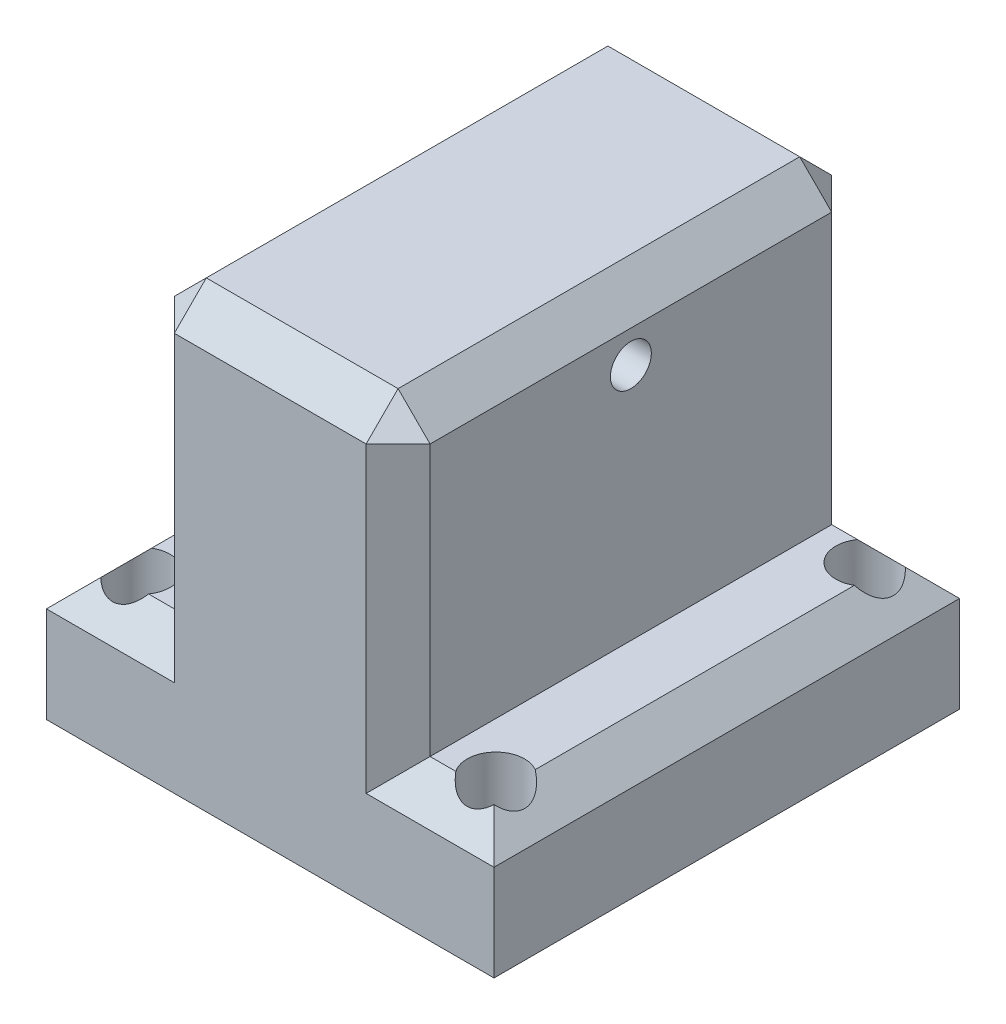
ISO-10303-21;
HEADER;
FILE_DESCRIPTION(('STEP AP214'),'2;1');
FILE_NAME('part.step','',(''),(''),'','','');
FILE_SCHEMA(('AUTOMOTIVE_DESIGN { 1 0 10303 214 1 1 1 1 }'));
ENDSEC;
DATA;
#1=APPLICATION_CONTEXT('core data for automotive mechanical design processes');
#2=APPLICATION_PROTOCOL_DEFINITION('international standard','automotive_design',2000,#1);
#3=PRODUCT_CONTEXT('',#1,'mechanical');
#4=PRODUCT('Part','Part','',(#3));
#5=PRODUCT_RELATED_PRODUCT_CATEGORY('part','',(#4));
#6=PRODUCT_DEFINITION_FORMATION('','',#4);
#7=PRODUCT_DEFINITION_CONTEXT('part definition',#1,'design');
#8=PRODUCT_DEFINITION('design','',#6,#7);
#9=PRODUCT_DEFINITION_SHAPE('','',#8);
#10=(LENGTH_UNIT() NAMED_UNIT(*) SI_UNIT(.MILLI.,.METRE.));
#11=(NAMED_UNIT(*) PLANE_ANGLE_UNIT() SI_UNIT($,.RADIAN.));
#12=(NAMED_UNIT(*) SI_UNIT($,.STERADIAN.) SOLID_ANGLE_UNIT());
#13=UNCERTAINTY_MEASURE_WITH_UNIT(LENGTH_MEASURE(1.E-05),#10,'distance_accuracy_value','');
#14=(GEOMETRIC_REPRESENTATION_CONTEXT(3) GLOBAL_UNCERTAINTY_ASSIGNED_CONTEXT((#13)) GLOBAL_UNIT_ASSIGNED_CONTEXT((#10,
#11,#12)) REPRESENTATION_CONTEXT('',''));
#15=CARTESIAN_POINT('',(0.,0.,0.));
#16=DIRECTION('',(0.,0.,1.));
#17=DIRECTION('',(1.,0.,0.));
#18=AXIS2_PLACEMENT_3D('',#15,#16,#17);
#19=CARTESIAN_POINT('',(0.,20.,0.));
#20=DIRECTION('',(0.,-1.,0.));
#21=DIRECTION('',(0.,0.,-1.));
#22=AXIS2_PLACEMENT_3D('',#19,#20,#21);
#23=PLANE('',#22);
#24=CARTESIAN_POINT('',(62.7217747705383,20.,-65.2423012591629));
#25=DIRECTION('',(0.,1.,0.));
#26=DIRECTION('',(0.,0.,1.));
#27=AXIS2_PLACEMENT_3D('',#24,#25,#26);
#28=CIRCLE('',#27,4.50000000000001);
#29=CARTESIAN_POINT('',(59.0283391270466,20.,-67.813008));
#30=VERTEX_POINT('',#29);
#31=CARTESIAN_POINT('',(65.,20.,-61.361619643281));
#32=VERTEX_POINT('',#31);
#33=EDGE_CURVE('E465',#30,#32,#28,.T.);
#34=ORIENTED_EDGE('',*,*,#33,.F.);
#35=DIRECTION('',(-1.,0.,0.));
#36=VECTOR('',#35,1.);
#37=CARTESIAN_POINT('',(0.,20.,-67.813008));
#38=LINE('',#37,#36);
#39=CARTESIAN_POINT('',(55.,20.,-67.813008));
#40=VERTEX_POINT('',#39);
#41=EDGE_CURVE('E293',#30,#40,#38,.T.);
#42=ORIENTED_EDGE('',*,*,#41,.T.);
#43=DIRECTION('',(0.,0.,-1.));
#44=VECTOR('',#43,1.);
#45=CARTESIAN_POINT('',(55.,20.,-72.813008));
#46=LINE('',#45,#44);
#47=CARTESIAN_POINT('',(55.,20.,-5.00000000000002));
#48=VERTEX_POINT('',#47);
#49=EDGE_CURVE('E451',#48,#40,#46,.T.);
#50=ORIENTED_EDGE('',*,*,#49,.F.);
#51=DIRECTION('',(1.,0.,0.));
#52=VECTOR('',#51,1.);
#53=CARTESIAN_POINT('',(0.,20.,-4.99999999999999));
#54=LINE('',#53,#52);
#55=CARTESIAN_POINT('',(59.0283391270466,20.,-4.99999999999999));
#56=VERTEX_POINT('',#55);
#57=EDGE_CURVE('E287',#48,#56,#54,.T.);
#58=ORIENTED_EDGE('',*,*,#57,.T.);
#59=CARTESIAN_POINT('',(62.7217747705383,20.,-7.57070674083708));
#60=DIRECTION('',(0.,1.,0.));
#61=DIRECTION('',(0.,0.,1.));
#62=AXIS2_PLACEMENT_3D('',#59,#60,#61);
#63=CIRCLE('',#62,4.5);
#64=CARTESIAN_POINT('',(65.,20.,-11.451388356719));
#65=VERTEX_POINT('',#64);
#66=EDGE_CURVE('E478',#65,#56,#63,.T.);
#67=ORIENTED_EDGE('',*,*,#66,.F.);
#68=DIRECTION('',(0.,0.,-1.));
#69=VECTOR('',#68,1.);
#70=CARTESIAN_POINT('',(65.,20.,0.));
#71=LINE('',#70,#69);
#72=EDGE_CURVE('E290',#65,#32,#71,.T.);
#73=ORIENTED_EDGE('',*,*,#72,.T.);
#74=EDGE_LOOP('',(#34,#42,#50,#58,#67,#73));
#75=FACE_BOUND('',#74,.T.);
#76=ADVANCED_FACE('F49',(#75),#23,.F.);
#77=DIRECTION('',(0.,0.,1.));
#78=VECTOR('',#77,1.);
#79=CARTESIAN_POINT('',(15.,20.,-72.813008));
#80=LINE('',#79,#78);
#81=CARTESIAN_POINT('',(15.,20.,-67.813008));
#82=VERTEX_POINT('',#81);
#83=CARTESIAN_POINT('',(15.,20.,-5.00000000000002));
#84=VERTEX_POINT('',#83);
#85=EDGE_CURVE('E457',#82,#84,#80,.T.);
#86=ORIENTED_EDGE('',*,*,#85,.F.);
#87=DIRECTION('',(-1.,0.,0.));
#88=VECTOR('',#87,1.);
#89=CARTESIAN_POINT('',(0.,20.,-67.813008));
#90=LINE('',#89,#88);
#91=CARTESIAN_POINT('',(10.9716608729534,20.,-67.813008));
#92=VERTEX_POINT('',#91);
#93=EDGE_CURVE('E261',#82,#92,#90,.T.);
#94=ORIENTED_EDGE('',*,*,#93,.T.);
#95=CARTESIAN_POINT('',(7.2782252294617,20.,-65.2423012591629));
#96=DIRECTION('',(0.,1.,0.));
#97=DIRECTION('',(0.,0.,1.));
#98=AXIS2_PLACEMENT_3D('',#95,#96,#97);
#99=CIRCLE('',#98,4.5);
#100=CARTESIAN_POINT('',(4.99999999999999,20.,-61.361619643281));
#101=VERTEX_POINT('',#100);
#102=EDGE_CURVE('E461',#101,#92,#99,.T.);
#103=ORIENTED_EDGE('',*,*,#102,.F.);
#104=DIRECTION('',(0.,0.,1.));
#105=VECTOR('',#104,1.);
#106=CARTESIAN_POINT('',(4.99999999999999,20.,0.));
#107=LINE('',#106,#105);
#108=CARTESIAN_POINT('',(4.99999999999999,20.,-11.451388356719));
#109=VERTEX_POINT('',#108);
#110=EDGE_CURVE('E258',#101,#109,#107,.T.);
#111=ORIENTED_EDGE('',*,*,#110,.T.);
#112=CARTESIAN_POINT('',(7.2782252294617,20.,-7.57070674083708));
#113=DIRECTION('',(0.,1.,0.));
#114=DIRECTION('',(0.,0.,1.));
#115=AXIS2_PLACEMENT_3D('',#112,#113,#114);
#116=CIRCLE('',#115,4.5);
#117=CARTESIAN_POINT('',(10.9716608729534,20.,-4.99999999999999));
#118=VERTEX_POINT('',#117);
#119=EDGE_CURVE('E470',#118,#109,#116,.T.);
#120=ORIENTED_EDGE('',*,*,#119,.F.);
#121=DIRECTION('',(1.,0.,0.));
#122=VECTOR('',#121,1.);
#123=CARTESIAN_POINT('',(0.,20.,-4.99999999999999));
#124=LINE('',#123,#122);
#125=EDGE_CURVE('E200',#118,#84,#124,.T.);
#126=ORIENTED_EDGE('',*,*,#125,.T.);
#127=EDGE_LOOP('',(#86,#94,#103,#111,#120,#126));
#128=FACE_BOUND('',#127,.T.);
#129=ADVANCED_FACE('F527',(#128),#23,.F.);
#130=CARTESIAN_POINT('',(62.7217747705383,20.,-65.2423012591629));
#131=DIRECTION('',(0.,-1.,0.));
#132=DIRECTION('',(0.,0.,-1.));
#133=AXIS2_PLACEMENT_3D('',#130,#131,#132);
#134=CYLINDRICAL_SURFACE('',#133,2.6);
#135=CARTESIAN_POINT('',(62.7217747705383,0.,-65.2423012591629));
#136=DIRECTION('',(0.,1.,0.));
#137=DIRECTION('',(0.,0.,1.));
#138=AXIS2_PLACEMENT_3D('',#135,#136,#137);
#139=CIRCLE('',#138,2.6);
#140=CARTESIAN_POINT('',(62.7217747705383,0.,-62.6423012591629));
#141=VERTEX_POINT('',#140);
#142=EDGE_CURVE('E218',#141,#141,#139,.T.);
#143=ORIENTED_EDGE('',*,*,#142,.F.);
#144=EDGE_LOOP('',(#143));
#145=FACE_BOUND('',#144,.T.);
#146=CARTESIAN_POINT('',(62.7217747705383,10.,-65.2423012591629));
#147=DIRECTION('',(0.,1.,0.));
#148=DIRECTION('',(0.,0.,1.));
#149=AXIS2_PLACEMENT_3D('',#146,#147,#148);
#150=CIRCLE('',#149,2.6);
#151=CARTESIAN_POINT('',(62.7217747705383,10.,-62.6423012591629));
#152=VERTEX_POINT('',#151);
#153=EDGE_CURVE('E251',#152,#152,#150,.T.);
#154=ORIENTED_EDGE('',*,*,#153,.T.);
#155=EDGE_LOOP('',(#154));
#156=FACE_BOUND('',#155,.T.);
#157=ADVANCED_FACE('F506',(#145,#156),#134,.F.);
#158=CARTESIAN_POINT('',(7.2782252294617,20.,-65.2423012591629));
#159=DIRECTION('',(0.,-1.,0.));
#160=DIRECTION('',(0.,0.,-1.));
#161=AXIS2_PLACEMENT_3D('',#158,#159,#160);
#162=CYLINDRICAL_SURFACE('',#161,2.6);
#163=CARTESIAN_POINT('',(7.2782252294617,0.,-65.2423012591629));
#164=DIRECTION('',(0.,1.,0.));
#165=DIRECTION('',(0.,0.,-1.));
#166=AXIS2_PLACEMENT_3D('',#163,#164,#165);
#167=CIRCLE('',#166,2.6);
#168=CARTESIAN_POINT('',(7.2782252294617,0.,-67.8423012591629));
#169=VERTEX_POINT('',#168);
#170=EDGE_CURVE('E222',#169,#169,#167,.T.);
#171=ORIENTED_EDGE('',*,*,#170,.F.);
#172=EDGE_LOOP('',(#171));
#173=FACE_BOUND('',#172,.T.);
#174=CARTESIAN_POINT('',(7.2782252294617,10.,-65.2423012591629));
#175=DIRECTION('',(0.,1.,0.));
#176=DIRECTION('',(0.,0.,1.));
#177=AXIS2_PLACEMENT_3D('',#174,#175,#176);
#178=CIRCLE('',#177,2.6);
#179=CARTESIAN_POINT('',(7.2782252294617,10.,-62.6423012591629));
#180=VERTEX_POINT('',#179);
#181=EDGE_CURVE('E247',#180,#180,#178,.T.);
#182=ORIENTED_EDGE('',*,*,#181,.T.);
#183=EDGE_LOOP('',(#182));
#184=FACE_BOUND('',#183,.T.);
#185=ADVANCED_FACE('F502',(#173,#184),#162,.F.);
#186=CARTESIAN_POINT('',(62.7217747705383,20.,-7.57070674083708));
#187=DIRECTION('',(0.,-1.,0.));
#188=DIRECTION('',(0.,0.,-1.));
#189=AXIS2_PLACEMENT_3D('',#186,#187,#188);
#190=CYLINDRICAL_SURFACE('',#189,2.6);
#191=CARTESIAN_POINT('',(62.7217747705383,0.,-7.57070674083708));
#192=DIRECTION('',(0.,1.,0.));
#193=DIRECTION('',(0.,0.,-1.));
#194=AXIS2_PLACEMENT_3D('',#191,#192,#193);
#195=CIRCLE('',#194,2.6);
#196=CARTESIAN_POINT('',(62.7217747705383,0.,-10.1707067408371));
#197=VERTEX_POINT('',#196);
#198=EDGE_CURVE('E494',#197,#197,#195,.T.);
#199=ORIENTED_EDGE('',*,*,#198,.F.);
#200=EDGE_LOOP('',(#199));
#201=FACE_BOUND('',#200,.T.);
#202=CARTESIAN_POINT('',(62.7217747705383,10.,-7.57070674083708));
#203=DIRECTION('',(0.,1.,0.));
#204=DIRECTION('',(0.,0.,1.));
#205=AXIS2_PLACEMENT_3D('',#202,#203,#204);
#206=CIRCLE('',#205,2.6);
#207=CARTESIAN_POINT('',(62.7217747705383,10.,-4.97070674083708));
#208=VERTEX_POINT('',#207);
#209=EDGE_CURVE('E242',#208,#208,#206,.T.);
#210=ORIENTED_EDGE('',*,*,#209,.T.);
#211=EDGE_LOOP('',(#210));
#212=FACE_BOUND('',#211,.T.);
#213=ADVANCED_FACE('F505',(#201,#212),#190,.F.);
#214=CARTESIAN_POINT('',(7.2782252294617,20.,-7.57070674083708));
#215=DIRECTION('',(0.,-1.,0.));
#216=DIRECTION('',(0.,0.,-1.));
#217=AXIS2_PLACEMENT_3D('',#214,#215,#216);
#218=CYLINDRICAL_SURFACE('',#217,2.6);
#219=CARTESIAN_POINT('',(7.2782252294617,0.,-7.57070674083708));
#220=DIRECTION('',(0.,1.,0.));
#221=DIRECTION('',(0.,0.,1.));
#222=AXIS2_PLACEMENT_3D('',#219,#220,#221);
#223=CIRCLE('',#222,2.6);
#224=CARTESIAN_POINT('',(7.2782252294617,0.,-4.97070674083708));
#225=VERTEX_POINT('',#224);
#226=EDGE_CURVE('E255',#225,#225,#223,.T.);
#227=ORIENTED_EDGE('',*,*,#226,.F.);
#228=EDGE_LOOP('',(#227));
#229=FACE_BOUND('',#228,.T.);
#230=CARTESIAN_POINT('',(7.2782252294617,10.,-7.57070674083708));
#231=DIRECTION('',(0.,1.,0.));
#232=DIRECTION('',(0.,0.,1.));
#233=AXIS2_PLACEMENT_3D('',#230,#231,#232);
#234=CIRCLE('',#233,2.6);
#235=CARTESIAN_POINT('',(7.2782252294617,10.,-4.97070674083708));
#236=VERTEX_POINT('',#235);
#237=EDGE_CURVE('E238',#236,#236,#234,.T.);
#238=ORIENTED_EDGE('',*,*,#237,.T.);
#239=EDGE_LOOP('',(#238));
#240=FACE_BOUND('',#239,.T.);
#241=ADVANCED_FACE('F632',(#229,#240),#218,.F.);
#242=CARTESIAN_POINT('',(0.,0.,0.));
#243=DIRECTION('',(0.,-1.,0.));
#244=DIRECTION('',(0.,0.,-1.));
#245=AXIS2_PLACEMENT_3D('',#242,#243,#244);
#246=PLANE('',#245);
#247=ORIENTED_EDGE('',*,*,#198,.T.);
#248=EDGE_LOOP('',(#247));
#249=FACE_BOUND('',#248,.T.);
#250=ORIENTED_EDGE('',*,*,#142,.T.);
#251=EDGE_LOOP('',(#250));
#252=FACE_BOUND('',#251,.T.);
#253=DIRECTION('',(0.,0.,1.));
#254=VECTOR('',#253,1.);
#255=CARTESIAN_POINT('',(0.,0.,0.));
#256=LINE('',#255,#254);
#257=CARTESIAN_POINT('',(0.,0.,-72.813008));
#258=VERTEX_POINT('',#257);
#259=CARTESIAN_POINT('',(0.,0.,0.));
#260=VERTEX_POINT('',#259);
#261=EDGE_CURVE('E208',#258,#260,#256,.T.);
#262=ORIENTED_EDGE('',*,*,#261,.F.);
#263=DIRECTION('',(-1.,0.,0.));
#264=VECTOR('',#263,1.);
#265=CARTESIAN_POINT('',(0.,0.,-72.813008));
#266=LINE('',#265,#264);
#267=CARTESIAN_POINT('',(70.,0.,-72.813008));
#268=VERTEX_POINT('',#267);
#269=EDGE_CURVE('E228',#268,#258,#266,.T.);
#270=ORIENTED_EDGE('',*,*,#269,.F.);
#271=DIRECTION('',(0.,0.,-1.));
#272=VECTOR('',#271,1.);
#273=CARTESIAN_POINT('',(70.,0.,0.));
#274=LINE('',#273,#272);
#275=CARTESIAN_POINT('',(70.,0.,0.));
#276=VERTEX_POINT('',#275);
#277=EDGE_CURVE('E210',#276,#268,#274,.T.);
#278=ORIENTED_EDGE('',*,*,#277,.F.);
#279=DIRECTION('',(1.,0.,0.));
#280=VECTOR('',#279,1.);
#281=CARTESIAN_POINT('',(0.,0.,0.));
#282=LINE('',#281,#280);
#283=EDGE_CURVE('E192',#260,#276,#282,.T.);
#284=ORIENTED_EDGE('',*,*,#283,.F.);
#285=EDGE_LOOP('',(#262,#270,#278,#284));
#286=FACE_BOUND('',#285,.T.);
#287=ORIENTED_EDGE('',*,*,#170,.T.);
#288=EDGE_LOOP('',(#287));
#289=FACE_BOUND('',#288,.T.);
#290=ORIENTED_EDGE('',*,*,#226,.T.);
#291=EDGE_LOOP('',(#290));
#292=FACE_BOUND('',#291,.T.);
#293=ADVANCED_FACE('F205',(#249,#252,#286,#289,#292),#246,.T.);
#294=CARTESIAN_POINT('',(0.,20.,0.));
#295=DIRECTION('',(1.,0.,0.));
#296=DIRECTION('',(0.,0.,-1.));
#297=AXIS2_PLACEMENT_3D('',#294,#295,#296);
#298=PLANE('',#297);
#299=DIRECTION('',(0.,-1.,0.));
#300=VECTOR('',#299,1.);
#301=CARTESIAN_POINT('',(0.,20.,0.));
#302=LINE('',#301,#300);
#303=CARTESIAN_POINT('',(0.,15.,0.));
#304=VERTEX_POINT('',#303);
#305=EDGE_CURVE('E188',#304,#260,#302,.T.);
#306=ORIENTED_EDGE('',*,*,#305,.F.);
#307=DIRECTION('',(0.,0.,-1.));
#308=VECTOR('',#307,1.);
#309=CARTESIAN_POINT('',(0.,15.,0.));
#310=LINE('',#309,#308);
#311=CARTESIAN_POINT('',(0.,15.,-72.813008));
#312=VERTEX_POINT('',#311);
#313=EDGE_CURVE('E309',#304,#312,#310,.T.);
#314=ORIENTED_EDGE('',*,*,#313,.T.);
#315=DIRECTION('',(0.,-1.,0.));
#316=VECTOR('',#315,1.);
#317=CARTESIAN_POINT('',(0.,20.,-72.813008));
#318=LINE('',#317,#316);
#319=EDGE_CURVE('E215',#312,#258,#318,.T.);
#320=ORIENTED_EDGE('',*,*,#319,.T.);
#321=ORIENTED_EDGE('',*,*,#261,.T.);
#322=EDGE_LOOP('',(#306,#314,#320,#321));
#323=FACE_BOUND('',#322,.T.);
#324=ADVANCED_FACE('F213',(#323),#298,.F.);
#325=CARTESIAN_POINT('',(0.,20.,0.));
#326=DIRECTION('',(0.,0.,-1.));
#327=DIRECTION('',(-1.,0.,0.));
#328=AXIS2_PLACEMENT_3D('',#325,#326,#327);
#329=PLANE('',#328);
#330=DIRECTION('',(0.,-1.,0.));
#331=VECTOR('',#330,1.);
#332=CARTESIAN_POINT('',(20.,20.,0.));
#333=LINE('',#332,#331);
#334=CARTESIAN_POINT('',(20.,62.328226,0.));
#335=VERTEX_POINT('',#334);
#336=CARTESIAN_POINT('',(20.,15.,0.));
#337=VERTEX_POINT('',#336);
#338=EDGE_CURVE('E318',#335,#337,#333,.T.);
#339=ORIENTED_EDGE('',*,*,#338,.T.);
#340=DIRECTION('',(-1.,0.,0.));
#341=VECTOR('',#340,1.);
#342=CARTESIAN_POINT('',(0.,15.,0.));
#343=LINE('',#342,#341);
#344=EDGE_CURVE('E195',#337,#304,#343,.T.);
#345=ORIENTED_EDGE('',*,*,#344,.T.);
#346=ORIENTED_EDGE('',*,*,#305,.T.);
#347=ORIENTED_EDGE('',*,*,#283,.T.);
#348=DIRECTION('',(0.,-1.,0.));
#349=VECTOR('',#348,1.);
#350=CARTESIAN_POINT('',(70.,20.,0.));
#351=LINE('',#350,#349);
#352=CARTESIAN_POINT('',(70.,15.,0.));
#353=VERTEX_POINT('',#352);
#354=EDGE_CURVE('E201',#353,#276,#351,.T.);
#355=ORIENTED_EDGE('',*,*,#354,.F.);
#356=DIRECTION('',(-1.,0.,0.));
#357=VECTOR('',#356,1.);
#358=CARTESIAN_POINT('',(0.,15.,0.));
#359=LINE('',#358,#357);
#360=CARTESIAN_POINT('',(50.,15.,0.));
#361=VERTEX_POINT('',#360);
#362=EDGE_CURVE('E321',#353,#361,#359,.T.);
#363=ORIENTED_EDGE('',*,*,#362,.T.);
#364=DIRECTION('',(0.,1.,0.));
#365=VECTOR('',#364,1.);
#366=CARTESIAN_POINT('',(50.,20.,0.));
#367=LINE('',#366,#365);
#368=CARTESIAN_POINT('',(50.,62.328226,0.));
#369=VERTEX_POINT('',#368);
#370=EDGE_CURVE('E312',#361,#369,#367,.T.);
#371=ORIENTED_EDGE('',*,*,#370,.T.);
#372=DIRECTION('',(-1.,0.,0.));
#373=VECTOR('',#372,1.);
#374=CARTESIAN_POINT('',(15.,62.328226,0.));
#375=LINE('',#374,#373);
#376=EDGE_CURVE('E315',#369,#335,#375,.T.);
#377=ORIENTED_EDGE('',*,*,#376,.T.);
#378=EDGE_LOOP('',(#339,#345,#346,#347,#355,#363,#371,#377));
#379=FACE_BOUND('',#378,.T.);
#380=ADVANCED_FACE('F190',(#379),#329,.F.);
#381=CARTESIAN_POINT('',(70.,20.,0.));
#382=DIRECTION('',(-1.,0.,0.));
#383=DIRECTION('',(0.,0.,1.));
#384=AXIS2_PLACEMENT_3D('',#381,#382,#383);
#385=PLANE('',#384);
#386=DIRECTION('',(0.,-1.,0.));
#387=VECTOR('',#386,1.);
#388=CARTESIAN_POINT('',(70.,20.,-72.813008));
#389=LINE('',#388,#387);
#390=CARTESIAN_POINT('',(70.,15.,-72.813008));
#391=VERTEX_POINT('',#390);
#392=EDGE_CURVE('E233',#391,#268,#389,.T.);
#393=ORIENTED_EDGE('',*,*,#392,.F.);
#394=DIRECTION('',(0.,0.,1.));
#395=VECTOR('',#394,1.);
#396=CARTESIAN_POINT('',(70.,15.,0.));
#397=LINE('',#396,#395);
#398=EDGE_CURVE('E326',#391,#353,#397,.T.);
#399=ORIENTED_EDGE('',*,*,#398,.T.);
#400=ORIENTED_EDGE('',*,*,#354,.T.);
#401=ORIENTED_EDGE('',*,*,#277,.T.);
#402=EDGE_LOOP('',(#393,#399,#400,#401));
#403=FACE_BOUND('',#402,.T.);
#404=ADVANCED_FACE('F571',(#403),#385,.F.);
#405=CARTESIAN_POINT('',(0.,20.,-72.813008));
#406=DIRECTION('',(0.,0.,1.));
#407=DIRECTION('',(1.,0.,0.));
#408=AXIS2_PLACEMENT_3D('',#405,#406,#407);
#409=PLANE('',#408);
#410=ORIENTED_EDGE('',*,*,#319,.F.);
#411=DIRECTION('',(1.,0.,0.));
#412=VECTOR('',#411,1.);
#413=CARTESIAN_POINT('',(0.,15.,-72.813008));
#414=LINE('',#413,#412);
#415=CARTESIAN_POINT('',(20.,15.,-72.813008));
#416=VERTEX_POINT('',#415);
#417=EDGE_CURVE('E283',#312,#416,#414,.T.);
#418=ORIENTED_EDGE('',*,*,#417,.T.);
#419=DIRECTION('',(0.,1.,0.));
#420=VECTOR('',#419,1.);
#421=CARTESIAN_POINT('',(20.,20.,-72.813008));
#422=LINE('',#421,#420);
#423=CARTESIAN_POINT('',(20.,62.328226,-72.813008));
#424=VERTEX_POINT('',#423);
#425=EDGE_CURVE('E271',#416,#424,#422,.T.);
#426=ORIENTED_EDGE('',*,*,#425,.T.);
#427=DIRECTION('',(1.,0.,0.));
#428=VECTOR('',#427,1.);
#429=CARTESIAN_POINT('',(55.,62.328226,-72.813008));
#430=LINE('',#429,#428);
#431=CARTESIAN_POINT('',(50.,62.328226,-72.813008));
#432=VERTEX_POINT('',#431);
#433=EDGE_CURVE('E274',#424,#432,#430,.T.);
#434=ORIENTED_EDGE('',*,*,#433,.T.);
#435=DIRECTION('',(0.,-1.,0.));
#436=VECTOR('',#435,1.);
#437=CARTESIAN_POINT('',(50.,20.,-72.813008));
#438=LINE('',#437,#436);
#439=CARTESIAN_POINT('',(50.,15.,-72.813008));
#440=VERTEX_POINT('',#439);
#441=EDGE_CURVE('E277',#432,#440,#438,.T.);
#442=ORIENTED_EDGE('',*,*,#441,.T.);
#443=DIRECTION('',(1.,0.,0.));
#444=VECTOR('',#443,1.);
#445=CARTESIAN_POINT('',(0.,15.,-72.813008));
#446=LINE('',#445,#444);
#447=EDGE_CURVE('E280',#440,#391,#446,.T.);
#448=ORIENTED_EDGE('',*,*,#447,.T.);
#449=ORIENTED_EDGE('',*,*,#392,.T.);
#450=ORIENTED_EDGE('',*,*,#269,.T.);
#451=EDGE_LOOP('',(#410,#418,#426,#434,#442,#448,#449,#450));
#452=FACE_BOUND('',#451,.T.);
#453=ADVANCED_FACE('F567',(#452),#409,.F.);
#454=CARTESIAN_POINT('',(7.2782252294617,10.,-7.57070674083708));
#455=DIRECTION('',(0.,1.,0.));
#456=DIRECTION('',(0.,0.,1.));
#457=AXIS2_PLACEMENT_3D('',#454,#455,#456);
#458=CYLINDRICAL_SURFACE('',#457,4.5);
#459=CARTESIAN_POINT('',(7.2782252294617,10.,-7.57070674083708));
#460=DIRECTION('',(0.,1.,0.));
#461=DIRECTION('',(0.,0.,1.));
#462=AXIS2_PLACEMENT_3D('',#459,#460,#461);
#463=CIRCLE('',#462,4.5);
#464=CARTESIAN_POINT('',(7.2782252294617,10.,-3.07070674083708));
#465=VERTEX_POINT('',#464);
#466=EDGE_CURVE('E474',#465,#465,#463,.T.);
#467=ORIENTED_EDGE('',*,*,#466,.F.);
#468=EDGE_LOOP('',(#467));
#469=FACE_BOUND('',#468,.T.);
#470=ORIENTED_EDGE('',*,*,#119,.T.);
#471=CARTESIAN_POINT('',(7.2782252294617,22.2782252294617,-7.57070674083708));
#472=DIRECTION('',(0.70710678118655,-0.707106781186545,0.));
#473=DIRECTION('',(0.707106781186545,0.70710678118655,0.));
#474=AXIS2_PLACEMENT_3D('',#471,#472,#473);
#475=ELLIPSE('',#474,6.36396103067895,4.5);
#476=CARTESIAN_POINT('',(4.24584778829468,19.2458477882947,-4.24584778829468));
#477=VERTEX_POINT('',#476);
#478=EDGE_CURVE('E306',#109,#477,#475,.F.);
#479=ORIENTED_EDGE('',*,*,#478,.T.);
#480=CARTESIAN_POINT('',(7.2782252294617,22.5707067408371,-7.57070674083708));
#481=DIRECTION('',(0.,-0.707106781186545,-0.70710678118655));
#482=DIRECTION('',(0.,0.70710678118655,-0.707106781186545));
#483=AXIS2_PLACEMENT_3D('',#480,#481,#482);
#484=ELLIPSE('',#483,6.36396103067895,4.5);
#485=EDGE_CURVE('E303',#477,#118,#484,.F.);
#486=ORIENTED_EDGE('',*,*,#485,.T.);
#487=EDGE_LOOP('',(#470,#479,#486));
#488=FACE_BOUND('',#487,.T.);
#489=ADVANCED_FACE('F537',(#469,#488),#458,.F.);
#490=CARTESIAN_POINT('',(7.2782252294617,10.,-7.57070674083708));
#491=DIRECTION('',(0.,1.,0.));
#492=DIRECTION('',(0.,0.,1.));
#493=AXIS2_PLACEMENT_3D('',#490,#491,#492);
#494=PLANE('',#493);
#495=ORIENTED_EDGE('',*,*,#237,.F.);
#496=EDGE_LOOP('',(#495));
#497=FACE_BOUND('',#496,.T.);
#498=ORIENTED_EDGE('',*,*,#466,.T.);
#499=EDGE_LOOP('',(#498));
#500=FACE_BOUND('',#499,.T.);
#501=ADVANCED_FACE('F745',(#497,#500),#494,.T.);
#502=CARTESIAN_POINT('',(62.7217747705383,10.,-7.57070674083708));
#503=DIRECTION('',(0.,1.,0.));
#504=DIRECTION('',(0.,0.,1.));
#505=AXIS2_PLACEMENT_3D('',#502,#503,#504);
#506=CYLINDRICAL_SURFACE('',#505,4.5);
#507=CARTESIAN_POINT('',(62.7217747705383,10.,-7.57070674083708));
#508=DIRECTION('',(0.,1.,0.));
#509=DIRECTION('',(0.,0.,1.));
#510=AXIS2_PLACEMENT_3D('',#507,#508,#509);
#511=CIRCLE('',#510,4.5);
#512=CARTESIAN_POINT('',(62.7217747705383,10.,-3.07070674083708));
#513=VERTEX_POINT('',#512);
#514=EDGE_CURVE('E460',#513,#513,#511,.T.);
#515=ORIENTED_EDGE('',*,*,#514,.F.);
#516=EDGE_LOOP('',(#515));
#517=FACE_BOUND('',#516,.T.);
#518=CARTESIAN_POINT('',(62.7217747705383,22.5707067408371,-7.57070674083708));
#519=DIRECTION('',(0.,-0.707106781186545,-0.70710678118655));
#520=DIRECTION('',(0.,0.70710678118655,-0.707106781186545));
#521=AXIS2_PLACEMENT_3D('',#518,#519,#520);
#522=ELLIPSE('',#521,6.36396103067896,4.5);
#523=CARTESIAN_POINT('',(65.7541522117053,19.2458477882947,-4.24584778829467));
#524=VERTEX_POINT('',#523);
#525=EDGE_CURVE('E329',#56,#524,#522,.F.);
#526=ORIENTED_EDGE('',*,*,#525,.T.);
#527=CARTESIAN_POINT('',(62.7217747705383,22.2782252294617,-7.57070674083708));
#528=DIRECTION('',(-0.70710678118655,-0.707106781186545,0.));
#529=DIRECTION('',(-0.707106781186545,0.70710678118655,0.));
#530=AXIS2_PLACEMENT_3D('',#527,#528,#529);
#531=ELLIPSE('',#530,6.36396103067896,4.5);
#532=EDGE_CURVE('E332',#524,#65,#531,.F.);
#533=ORIENTED_EDGE('',*,*,#532,.T.);
#534=ORIENTED_EDGE('',*,*,#66,.T.);
#535=EDGE_LOOP('',(#526,#533,#534));
#536=FACE_BOUND('',#535,.T.);
#537=ADVANCED_FACE('F749',(#517,#536),#506,.F.);
#538=CARTESIAN_POINT('',(62.7217747705383,10.,-7.57070674083708));
#539=DIRECTION('',(0.,1.,0.));
#540=DIRECTION('',(0.,0.,1.));
#541=AXIS2_PLACEMENT_3D('',#538,#539,#540);
#542=PLANE('',#541);
#543=ORIENTED_EDGE('',*,*,#209,.F.);
#544=EDGE_LOOP('',(#543));
#545=FACE_BOUND('',#544,.T.);
#546=ORIENTED_EDGE('',*,*,#514,.T.);
#547=EDGE_LOOP('',(#546));
#548=FACE_BOUND('',#547,.T.);
#549=ADVANCED_FACE('F520',(#545,#548),#542,.T.);
#550=CARTESIAN_POINT('',(7.2782252294617,10.,-65.2423012591629));
#551=DIRECTION('',(0.,1.,0.));
#552=DIRECTION('',(0.,0.,1.));
#553=AXIS2_PLACEMENT_3D('',#550,#551,#552);
#554=CYLINDRICAL_SURFACE('',#553,4.5);
#555=CARTESIAN_POINT('',(7.2782252294617,10.,-65.2423012591629));
#556=DIRECTION('',(0.,1.,0.));
#557=DIRECTION('',(0.,0.,1.));
#558=AXIS2_PLACEMENT_3D('',#555,#556,#557);
#559=CIRCLE('',#558,4.5);
#560=CARTESIAN_POINT('',(7.2782252294617,10.,-60.7423012591629));
#561=VERTEX_POINT('',#560);
#562=EDGE_CURVE('E466',#561,#561,#559,.T.);
#563=ORIENTED_EDGE('',*,*,#562,.F.);
#564=EDGE_LOOP('',(#563));
#565=FACE_BOUND('',#564,.T.);
#566=ORIENTED_EDGE('',*,*,#102,.T.);
#567=CARTESIAN_POINT('',(7.2782252294617,22.5707067408371,-65.2423012591629));
#568=DIRECTION('',(0.,-0.707106781186545,0.70710678118655));
#569=DIRECTION('',(0.,0.70710678118655,0.707106781186545));
#570=AXIS2_PLACEMENT_3D('',#567,#568,#569);
#571=ELLIPSE('',#570,6.36396103067895,4.5);
#572=CARTESIAN_POINT('',(4.24584778829468,19.2458477882947,-68.5671602117053));
#573=VERTEX_POINT('',#572);
#574=EDGE_CURVE('E268',#92,#573,#571,.F.);
#575=ORIENTED_EDGE('',*,*,#574,.T.);
#576=CARTESIAN_POINT('',(7.2782252294617,22.2782252294617,-65.2423012591629));
#577=DIRECTION('',(0.70710678118655,-0.707106781186545,0.));
#578=DIRECTION('',(0.707106781186545,0.70710678118655,0.));
#579=AXIS2_PLACEMENT_3D('',#576,#577,#578);
#580=ELLIPSE('',#579,6.36396103067895,4.5);
#581=EDGE_CURVE('E265',#573,#101,#580,.F.);
#582=ORIENTED_EDGE('',*,*,#581,.T.);
#583=EDGE_LOOP('',(#566,#575,#582));
#584=FACE_BOUND('',#583,.T.);
#585=ADVANCED_FACE('F514',(#565,#584),#554,.F.);
#586=CARTESIAN_POINT('',(7.2782252294617,10.,-65.2423012591629));
#587=DIRECTION('',(0.,1.,0.));
#588=DIRECTION('',(0.,0.,1.));
#589=AXIS2_PLACEMENT_3D('',#586,#587,#588);
#590=PLANE('',#589);
#591=ORIENTED_EDGE('',*,*,#181,.F.);
#592=EDGE_LOOP('',(#591));
#593=FACE_BOUND('',#592,.T.);
#594=ORIENTED_EDGE('',*,*,#562,.T.);
#595=EDGE_LOOP('',(#594));
#596=FACE_BOUND('',#595,.T.);
#597=ADVANCED_FACE('F510',(#593,#596),#590,.T.);
#598=CARTESIAN_POINT('',(62.7217747705383,10.,-65.2423012591629));
#599=DIRECTION('',(0.,1.,0.));
#600=DIRECTION('',(0.,0.,1.));
#601=AXIS2_PLACEMENT_3D('',#598,#599,#600);
#602=CYLINDRICAL_SURFACE('',#601,4.50000000000001);
#603=CARTESIAN_POINT('',(62.7217747705383,10.,-65.2423012591629));
#604=DIRECTION('',(0.,1.,0.));
#605=DIRECTION('',(0.,0.,1.));
#606=AXIS2_PLACEMENT_3D('',#603,#604,#605);
#607=CIRCLE('',#606,4.50000000000001);
#608=CARTESIAN_POINT('',(62.7217747705383,10.,-60.7423012591629));
#609=VERTEX_POINT('',#608);
#610=EDGE_CURVE('E243',#609,#609,#607,.T.);
#611=ORIENTED_EDGE('',*,*,#610,.F.);
#612=EDGE_LOOP('',(#611));
#613=FACE_BOUND('',#612,.T.);
#614=CARTESIAN_POINT('',(62.7217747705383,22.2782252294617,-65.2423012591629));
#615=DIRECTION('',(-0.70710678118655,-0.707106781186545,0.));
#616=DIRECTION('',(-0.707106781186545,0.70710678118655,0.));
#617=AXIS2_PLACEMENT_3D('',#614,#615,#616);
#618=ELLIPSE('',#617,6.36396103067896,4.50000000000001);
#619=CARTESIAN_POINT('',(65.7541522117053,19.2458477882947,-68.5671602117053));
#620=VERTEX_POINT('',#619);
#621=EDGE_CURVE('E297',#32,#620,#618,.F.);
#622=ORIENTED_EDGE('',*,*,#621,.T.);
#623=CARTESIAN_POINT('',(62.7217747705383,22.5707067408371,-65.2423012591629));
#624=DIRECTION('',(0.,-0.707106781186545,0.70710678118655));
#625=DIRECTION('',(0.,0.70710678118655,0.707106781186545));
#626=AXIS2_PLACEMENT_3D('',#623,#624,#625);
#627=ELLIPSE('',#626,6.36396103067896,4.50000000000001);
#628=EDGE_CURVE('E300',#620,#30,#627,.F.);
#629=ORIENTED_EDGE('',*,*,#628,.T.);
#630=ORIENTED_EDGE('',*,*,#33,.T.);
#631=EDGE_LOOP('',(#622,#629,#630));
#632=FACE_BOUND('',#631,.T.);
#633=ADVANCED_FACE('F513',(#613,#632),#602,.F.);
#634=CARTESIAN_POINT('',(62.7217747705383,10.,-65.2423012591629));
#635=DIRECTION('',(0.,1.,0.));
#636=DIRECTION('',(0.,0.,1.));
#637=AXIS2_PLACEMENT_3D('',#634,#635,#636);
#638=PLANE('',#637);
#639=ORIENTED_EDGE('',*,*,#153,.F.);
#640=EDGE_LOOP('',(#639));
#641=FACE_BOUND('',#640,.T.);
#642=ORIENTED_EDGE('',*,*,#610,.T.);
#643=EDGE_LOOP('',(#642));
#644=FACE_BOUND('',#643,.T.);
#645=ADVANCED_FACE('F741',(#641,#644),#638,.T.);
#646=CARTESIAN_POINT('',(55.,67.328226,-72.813008));
#647=DIRECTION('',(-1.,0.,0.));
#648=DIRECTION('',(0.,0.,1.));
#649=AXIS2_PLACEMENT_3D('',#646,#647,#648);
#650=PLANE('',#649);
#651=ORIENTED_EDGE('',*,*,#49,.T.);
#652=DIRECTION('',(0.,1.,0.));
#653=VECTOR('',#652,1.);
#654=CARTESIAN_POINT('',(55.,67.328226,-67.813008));
#655=LINE('',#654,#653);
#656=CARTESIAN_POINT('',(55.,62.328226,-67.813008));
#657=VERTEX_POINT('',#656);
#658=EDGE_CURVE('E341',#40,#657,#655,.T.);
#659=ORIENTED_EDGE('',*,*,#658,.T.);
#660=DIRECTION('',(0.,0.,1.));
#661=VECTOR('',#660,1.);
#662=CARTESIAN_POINT('',(55.,62.328226,0.));
#663=LINE('',#662,#661);
#664=CARTESIAN_POINT('',(55.,62.328226,-5.00000000000002));
#665=VERTEX_POINT('',#664);
#666=EDGE_CURVE('E335',#657,#665,#663,.T.);
#667=ORIENTED_EDGE('',*,*,#666,.T.);
#668=DIRECTION('',(0.,-1.,0.));
#669=VECTOR('',#668,1.);
#670=CARTESIAN_POINT('',(55.,67.328226,-5.00000000000002));
#671=LINE('',#670,#669);
#672=EDGE_CURVE('E338',#665,#48,#671,.T.);
#673=ORIENTED_EDGE('',*,*,#672,.T.);
#674=EDGE_LOOP('',(#651,#659,#667,#673));
#675=FACE_BOUND('',#674,.T.);
#676=CARTESIAN_POINT('',(55.,57.328226,-36.406504));
#677=DIRECTION('',(1.,0.,0.));
#678=DIRECTION('',(0.,0.,-1.));
#679=AXIS2_PLACEMENT_3D('',#676,#677,#678);
#680=CIRCLE('',#679,3.2);
#681=CARTESIAN_POINT('',(55.,57.328226,-39.606504));
#682=VERTEX_POINT('',#681);
#683=EDGE_CURVE('E438',#682,#682,#680,.T.);
#684=ORIENTED_EDGE('',*,*,#683,.F.);
#685=EDGE_LOOP('',(#684));
#686=FACE_BOUND('',#685,.T.);
#687=ADVANCED_FACE('F604',(#675,#686),#650,.F.);
#688=CARTESIAN_POINT('',(15.,67.328226,-72.813008));
#689=DIRECTION('',(1.,0.,0.));
#690=DIRECTION('',(0.,0.,-1.));
#691=AXIS2_PLACEMENT_3D('',#688,#689,#690);
#692=PLANE('',#691);
#693=DIRECTION('',(0.,0.,-1.));
#694=VECTOR('',#693,1.);
#695=CARTESIAN_POINT('',(15.,62.328226,-72.813008));
#696=LINE('',#695,#694);
#697=CARTESIAN_POINT('',(15.,62.328226,-5.00000000000002));
#698=VERTEX_POINT('',#697);
#699=CARTESIAN_POINT('',(15.,62.328226,-67.813008));
#700=VERTEX_POINT('',#699);
#701=EDGE_CURVE('E60',#698,#700,#696,.T.);
#702=ORIENTED_EDGE('',*,*,#701,.T.);
#703=DIRECTION('',(0.,-1.,0.));
#704=VECTOR('',#703,1.);
#705=CARTESIAN_POINT('',(15.,67.328226,-67.813008));
#706=LINE('',#705,#704);
#707=EDGE_CURVE('E11',#700,#82,#706,.T.);
#708=ORIENTED_EDGE('',*,*,#707,.T.);
#709=ORIENTED_EDGE('',*,*,#85,.T.);
#710=DIRECTION('',(0.,1.,0.));
#711=VECTOR('',#710,1.);
#712=CARTESIAN_POINT('',(15.,67.328226,-5.00000000000002));
#713=LINE('',#712,#711);
#714=EDGE_CURVE('E71',#84,#698,#713,.T.);
#715=ORIENTED_EDGE('',*,*,#714,.T.);
#716=EDGE_LOOP('',(#702,#708,#709,#715));
#717=FACE_BOUND('',#716,.T.);
#718=ADVANCED_FACE('F543',(#717),#692,.F.);
#719=CARTESIAN_POINT('',(0.,67.328226,0.));
#720=DIRECTION('',(0.,1.,0.));
#721=DIRECTION('',(0.,0.,1.));
#722=AXIS2_PLACEMENT_3D('',#719,#720,#721);
#723=PLANE('',#722);
#724=DIRECTION('',(0.,0.,-1.));
#725=VECTOR('',#724,1.);
#726=CARTESIAN_POINT('',(50.,67.328226,-72.813008));
#727=LINE('',#726,#725);
#728=CARTESIAN_POINT('',(50.,67.328226,-4.99999999999999));
#729=VERTEX_POINT('',#728);
#730=CARTESIAN_POINT('',(50.,67.328226,-67.813008));
#731=VERTEX_POINT('',#730);
#732=EDGE_CURVE('E344',#729,#731,#727,.T.);
#733=ORIENTED_EDGE('',*,*,#732,.T.);
#734=DIRECTION('',(-1.,0.,0.));
#735=VECTOR('',#734,1.);
#736=CARTESIAN_POINT('',(15.,67.328226,-67.813008));
#737=LINE('',#736,#735);
#738=CARTESIAN_POINT('',(20.,67.328226,-67.813008));
#739=VERTEX_POINT('',#738);
#740=EDGE_CURVE('E353',#731,#739,#737,.T.);
#741=ORIENTED_EDGE('',*,*,#740,.T.);
#742=DIRECTION('',(0.,0.,1.));
#743=VECTOR('',#742,1.);
#744=CARTESIAN_POINT('',(20.,67.328226,0.));
#745=LINE('',#744,#743);
#746=CARTESIAN_POINT('',(20.,67.328226,-4.99999999999999));
#747=VERTEX_POINT('',#746);
#748=EDGE_CURVE('E350',#739,#747,#745,.T.);
#749=ORIENTED_EDGE('',*,*,#748,.T.);
#750=DIRECTION('',(1.,0.,0.));
#751=VECTOR('',#750,1.);
#752=CARTESIAN_POINT('',(55.,67.328226,-4.99999999999999));
#753=LINE('',#752,#751);
#754=EDGE_CURVE('E347',#747,#729,#753,.T.);
#755=ORIENTED_EDGE('',*,*,#754,.T.);
#756=EDGE_LOOP('',(#733,#741,#749,#755));
#757=FACE_BOUND('',#756,.T.);
#758=ADVANCED_FACE('F585',(#757),#723,.T.);
#759=CARTESIAN_POINT('',(45.,57.328226,-36.406504));
#760=DIRECTION('',(1.,0.,0.));
#761=DIRECTION('',(0.,0.,-1.));
#762=AXIS2_PLACEMENT_3D('',#759,#760,#761);
#763=CYLINDRICAL_SURFACE('',#762,3.2);
#764=CARTESIAN_POINT('',(45.,57.328226,-36.406504));
#765=DIRECTION('',(1.,0.,0.));
#766=DIRECTION('',(0.,0.,-1.));
#767=AXIS2_PLACEMENT_3D('',#764,#765,#766);
#768=CIRCLE('',#767,3.2);
#769=CARTESIAN_POINT('',(45.,57.328226,-39.606504));
#770=VERTEX_POINT('',#769);
#771=EDGE_CURVE('E445',#770,#770,#768,.T.);
#772=ORIENTED_EDGE('',*,*,#771,.F.);
#773=EDGE_LOOP('',(#772));
#774=FACE_BOUND('',#773,.T.);
#775=ORIENTED_EDGE('',*,*,#683,.T.);
#776=EDGE_LOOP('',(#775));
#777=FACE_BOUND('',#776,.T.);
#778=ADVANCED_FACE('F728',(#774,#777),#763,.F.);
#779=CARTESIAN_POINT('',(45.,57.328226,-36.406504));
#780=DIRECTION('',(1.,0.,0.));
#781=DIRECTION('',(0.,0.,-1.));
#782=AXIS2_PLACEMENT_3D('',#779,#780,#781);
#783=PLANE('',#782);
#784=ORIENTED_EDGE('',*,*,#771,.T.);
#785=EDGE_LOOP('',(#784));
#786=FACE_BOUND('',#785,.T.);
#787=ADVANCED_FACE('F724',(#786),#783,.T.);
#788=CARTESIAN_POINT('',(0.,20.,-4.99999999999999));
#789=DIRECTION('',(0.,-0.707106781186545,-0.70710678118655));
#790=DIRECTION('',(1.,0.,0.));
#791=AXIS2_PLACEMENT_3D('',#788,#789,#790);
#792=PLANE('',#791);
#793=DIRECTION('',(0.577350269189622,0.57735026918963,-0.577350269189626));
#794=VECTOR('',#793,1.);
#795=CARTESIAN_POINT('',(36.6666666666669,1.66666666666667,13.3333333333332));
#796=LINE('',#795,#794);
#797=EDGE_CURVE('E429',#361,#48,#796,.T.);
#798=ORIENTED_EDGE('',*,*,#797,.F.);
#799=ORIENTED_EDGE('',*,*,#362,.F.);
#800=DIRECTION('',(-0.577350269189624,0.577350269189628,-0.577350269189624));
#801=VECTOR('',#800,1.);
#802=CARTESIAN_POINT('',(43.3333333333334,41.6666666666667,-26.6666666666666));
#803=LINE('',#802,#801);
#804=EDGE_CURVE('E54',#524,#353,#803,.F.);
#805=ORIENTED_EDGE('',*,*,#804,.F.);
#806=ORIENTED_EDGE('',*,*,#525,.F.);
#807=ORIENTED_EDGE('',*,*,#57,.F.);
#808=EDGE_LOOP('',(#798,#799,#805,#806,#807));
#809=FACE_BOUND('',#808,.T.);
#810=ADVANCED_FACE('F52',(#809),#792,.F.);
#811=CARTESIAN_POINT('',(65.,20.,0.));
#812=DIRECTION('',(-0.70710678118655,-0.707106781186545,0.));
#813=DIRECTION('',(0.,0.,-1.));
#814=AXIS2_PLACEMENT_3D('',#811,#812,#813);
#815=PLANE('',#814);
#816=ORIENTED_EDGE('',*,*,#804,.T.);
#817=ORIENTED_EDGE('',*,*,#398,.F.);
#818=DIRECTION('',(-0.577350269189624,0.577350269189628,0.577350269189624));
#819=VECTOR('',#818,1.);
#820=CARTESIAN_POINT('',(42.3956640000001,42.6043360000001,-45.2086720000001));
#821=LINE('',#820,#819);
#822=EDGE_CURVE('E426',#620,#391,#821,.F.);
#823=ORIENTED_EDGE('',*,*,#822,.F.);
#824=ORIENTED_EDGE('',*,*,#621,.F.);
#825=ORIENTED_EDGE('',*,*,#72,.F.);
#826=ORIENTED_EDGE('',*,*,#532,.F.);
#827=EDGE_LOOP('',(#816,#817,#823,#824,#825,#826));
#828=FACE_BOUND('',#827,.T.);
#829=ADVANCED_FACE('F716',(#828),#815,.F.);
#830=CARTESIAN_POINT('',(55.,67.328226,-5.00000000000002));
#831=DIRECTION('',(-0.707106781186549,0.,-0.707106781186545));
#832=DIRECTION('',(0.,-1.,0.));
#833=AXIS2_PLACEMENT_3D('',#830,#831,#832);
#834=PLANE('',#833);
#835=ORIENTED_EDGE('',*,*,#797,.T.);
#836=ORIENTED_EDGE('',*,*,#672,.F.);
#837=DIRECTION('',(-0.707106781186545,0.,0.707106781186549));
#838=VECTOR('',#837,1.);
#839=CARTESIAN_POINT('',(52.5,62.328226,-2.50000000000001));
#840=LINE('',#839,#838);
#841=EDGE_CURVE('E422',#369,#665,#840,.F.);
#842=ORIENTED_EDGE('',*,*,#841,.F.);
#843=ORIENTED_EDGE('',*,*,#370,.F.);
#844=EDGE_LOOP('',(#835,#836,#842,#843));
#845=FACE_BOUND('',#844,.T.);
#846=ADVANCED_FACE('F577',(#845),#834,.F.);
#847=CARTESIAN_POINT('',(0.,20.,-67.813008));
#848=DIRECTION('',(0.,-0.707106781186545,0.70710678118655));
#849=DIRECTION('',(-1.,0.,0.));
#850=AXIS2_PLACEMENT_3D('',#847,#848,#849);
#851=PLANE('',#850);
#852=ORIENTED_EDGE('',*,*,#822,.T.);
#853=ORIENTED_EDGE('',*,*,#447,.F.);
#854=DIRECTION('',(-0.577350269189622,-0.57735026918963,-0.577350269189626));
#855=VECTOR('',#854,1.);
#856=CARTESIAN_POINT('',(36.6666666666669,1.66666666666667,-86.1463413333332));
#857=LINE('',#856,#855);
#858=EDGE_CURVE('E418',#40,#440,#857,.T.);
#859=ORIENTED_EDGE('',*,*,#858,.F.);
#860=ORIENTED_EDGE('',*,*,#41,.F.);
#861=ORIENTED_EDGE('',*,*,#628,.F.);
#862=EDGE_LOOP('',(#852,#853,#859,#860,#861));
#863=FACE_BOUND('',#862,.T.);
#864=ADVANCED_FACE('F610',(#863),#851,.F.);
#865=CARTESIAN_POINT('',(50.,67.328226,-4.99999999999999));
#866=DIRECTION('',(0.577350269189629,0.577350269189622,0.577350269189626));
#867=DIRECTION('',(0.707106781186545,0.,-0.70710678118655));
#868=AXIS2_PLACEMENT_3D('',#865,#866,#867);
#869=PLANE('',#868);
#870=DIRECTION('',(0.,-0.707106781186549,0.707106781186545));
#871=VECTOR('',#870,1.);
#872=CARTESIAN_POINT('',(50.,67.328226,-4.99999999999999));
#873=LINE('',#872,#871);
#874=EDGE_CURVE('E410',#369,#729,#873,.F.);
#875=ORIENTED_EDGE('',*,*,#874,.F.);
#876=ORIENTED_EDGE('',*,*,#841,.T.);
#877=DIRECTION('',(-0.707106781186545,0.70710678118655,0.));
#878=VECTOR('',#877,1.);
#879=CARTESIAN_POINT('',(50.,67.328226,-4.99999999999999));
#880=LINE('',#879,#878);
#881=EDGE_CURVE('E414',#729,#665,#880,.F.);
#882=ORIENTED_EDGE('',*,*,#881,.F.);
#883=EDGE_LOOP('',(#875,#876,#882));
#884=FACE_BOUND('',#883,.T.);
#885=ADVANCED_FACE('F608',(#884),#869,.T.);
#886=CARTESIAN_POINT('',(50.,20.,-72.813008));
#887=DIRECTION('',(-0.707106781186549,0.,0.707106781186545));
#888=DIRECTION('',(0.,-1.,0.));
#889=AXIS2_PLACEMENT_3D('',#886,#887,#888);
#890=PLANE('',#889);
#891=ORIENTED_EDGE('',*,*,#858,.T.);
#892=ORIENTED_EDGE('',*,*,#441,.F.);
#893=DIRECTION('',(0.707106781186545,0.,0.707106781186549));
#894=VECTOR('',#893,1.);
#895=CARTESIAN_POINT('',(55.,62.328226,-67.813008));
#896=LINE('',#895,#894);
#897=EDGE_CURVE('E406',#657,#432,#896,.F.);
#898=ORIENTED_EDGE('',*,*,#897,.F.);
#899=ORIENTED_EDGE('',*,*,#658,.F.);
#900=EDGE_LOOP('',(#891,#892,#898,#899));
#901=FACE_BOUND('',#900,.T.);
#902=ADVANCED_FACE('F596',(#901),#890,.F.);
#903=CARTESIAN_POINT('',(50.,67.328226,0.));
#904=DIRECTION('',(0.70710678118655,0.707106781186545,0.));
#905=DIRECTION('',(0.,0.,1.));
#906=AXIS2_PLACEMENT_3D('',#903,#904,#905);
#907=PLANE('',#906);
#908=ORIENTED_EDGE('',*,*,#881,.T.);
#909=ORIENTED_EDGE('',*,*,#666,.F.);
#910=DIRECTION('',(0.707106781186545,-0.70710678118655,0.));
#911=VECTOR('',#910,1.);
#912=CARTESIAN_POINT('',(55.,62.328226,-67.813008));
#913=LINE('',#912,#911);
#914=EDGE_CURVE('E402',#731,#657,#913,.T.);
#915=ORIENTED_EDGE('',*,*,#914,.F.);
#916=ORIENTED_EDGE('',*,*,#732,.F.);
#917=EDGE_LOOP('',(#908,#909,#915,#916));
#918=FACE_BOUND('',#917,.T.);
#919=ADVANCED_FACE('F602',(#918),#907,.T.);
#920=CARTESIAN_POINT('',(0.,67.328226,-4.99999999999999));
#921=DIRECTION('',(0.,0.707106781186545,0.707106781186549));
#922=DIRECTION('',(-1.,0.,0.));
#923=AXIS2_PLACEMENT_3D('',#920,#921,#922);
#924=PLANE('',#923);
#925=ORIENTED_EDGE('',*,*,#874,.T.);
#926=ORIENTED_EDGE('',*,*,#754,.F.);
#927=DIRECTION('',(0.,0.70710678118655,-0.707106781186546));
#928=VECTOR('',#927,1.);
#929=CARTESIAN_POINT('',(20.,67.328226,-4.99999999999999));
#930=LINE('',#929,#928);
#931=EDGE_CURVE('E398',#335,#747,#930,.T.);
#932=ORIENTED_EDGE('',*,*,#931,.F.);
#933=ORIENTED_EDGE('',*,*,#376,.F.);
#934=EDGE_LOOP('',(#925,#926,#932,#933));
#935=FACE_BOUND('',#934,.T.);
#936=ADVANCED_FACE('F582',(#935),#924,.T.);
#937=CARTESIAN_POINT('',(55.,62.328226,-67.813008));
#938=DIRECTION('',(0.577350269189629,0.577350269189622,-0.577350269189626));
#939=DIRECTION('',(-0.707106781186545,0.,-0.70710678118655));
#940=AXIS2_PLACEMENT_3D('',#937,#938,#939);
#941=PLANE('',#940);
#942=ORIENTED_EDGE('',*,*,#914,.T.);
#943=ORIENTED_EDGE('',*,*,#897,.T.);
#944=DIRECTION('',(0.,0.707106781186549,0.707106781186545));
#945=VECTOR('',#944,1.);
#946=CARTESIAN_POINT('',(50.,64.828226,-70.313008));
#947=LINE('',#946,#945);
#948=EDGE_CURVE('E394',#731,#432,#947,.F.);
#949=ORIENTED_EDGE('',*,*,#948,.F.);
#950=EDGE_LOOP('',(#942,#943,#949));
#951=FACE_BOUND('',#950,.T.);
#952=ADVANCED_FACE('F599',(#951),#941,.T.);
#953=CARTESIAN_POINT('',(20.,67.328226,-4.99999999999999));
#954=DIRECTION('',(-0.57735026918963,0.577350269189622,0.577350269189625));
#955=DIRECTION('',(0.707106781186545,0.,0.70710678118655));
#956=AXIS2_PLACEMENT_3D('',#953,#954,#955);
#957=PLANE('',#956);
#958=DIRECTION('',(-0.707106781186545,0.,-0.70710678118655));
#959=VECTOR('',#958,1.);
#960=CARTESIAN_POINT('',(17.5,62.328226,-2.50000000000001));
#961=LINE('',#960,#959);
#962=EDGE_CURVE('E387',#335,#698,#961,.T.);
#963=ORIENTED_EDGE('',*,*,#962,.F.);
#964=ORIENTED_EDGE('',*,*,#931,.T.);
#965=DIRECTION('',(-0.707106781186545,-0.70710678118655,0.));
#966=VECTOR('',#965,1.);
#967=CARTESIAN_POINT('',(20.,67.328226,-4.99999999999999));
#968=LINE('',#967,#966);
#969=EDGE_CURVE('E390',#698,#747,#968,.F.);
#970=ORIENTED_EDGE('',*,*,#969,.F.);
#971=EDGE_LOOP('',(#963,#964,#970));
#972=FACE_BOUND('',#971,.T.);
#973=ADVANCED_FACE('F551',(#972),#957,.T.);
#974=CARTESIAN_POINT('',(0.,67.328226,-67.813008));
#975=DIRECTION('',(0.,0.707106781186545,-0.707106781186549));
#976=DIRECTION('',(1.,0.,0.));
#977=AXIS2_PLACEMENT_3D('',#974,#975,#976);
#978=PLANE('',#977);
#979=ORIENTED_EDGE('',*,*,#948,.T.);
#980=ORIENTED_EDGE('',*,*,#433,.F.);
#981=DIRECTION('',(0.,-0.70710678118655,-0.707106781186546));
#982=VECTOR('',#981,1.);
#983=CARTESIAN_POINT('',(20.,67.328226,-67.813008));
#984=LINE('',#983,#982);
#985=EDGE_CURVE('E383',#739,#424,#984,.T.);
#986=ORIENTED_EDGE('',*,*,#985,.F.);
#987=ORIENTED_EDGE('',*,*,#740,.F.);
#988=EDGE_LOOP('',(#979,#980,#986,#987));
#989=FACE_BOUND('',#988,.T.);
#990=ADVANCED_FACE('F590',(#989),#978,.T.);
#991=CARTESIAN_POINT('',(20.,67.328226,0.));
#992=DIRECTION('',(-0.70710678118655,0.707106781186545,0.));
#993=DIRECTION('',(0.,0.,-1.));
#994=AXIS2_PLACEMENT_3D('',#991,#992,#993);
#995=PLANE('',#994);
#996=ORIENTED_EDGE('',*,*,#969,.T.);
#997=ORIENTED_EDGE('',*,*,#748,.F.);
#998=DIRECTION('',(0.707106781186545,0.70710678118655,0.));
#999=VECTOR('',#998,1.);
#1000=CARTESIAN_POINT('',(20.,67.328226,-67.813008));
#1001=LINE('',#1000,#999);
#1002=EDGE_CURVE('E380',#700,#739,#1001,.T.);
#1003=ORIENTED_EDGE('',*,*,#1002,.F.);
#1004=ORIENTED_EDGE('',*,*,#701,.F.);
#1005=EDGE_LOOP('',(#996,#997,#1003,#1004));
#1006=FACE_BOUND('',#1005,.T.);
#1007=ADVANCED_FACE('F555',(#1006),#995,.T.);
#1008=CARTESIAN_POINT('',(20.,20.,0.));
#1009=DIRECTION('',(0.70710678118655,0.,-0.707106781186545));
#1010=DIRECTION('',(0.,-1.,0.));
#1011=AXIS2_PLACEMENT_3D('',#1008,#1009,#1010);
#1012=PLANE('',#1011);
#1013=ORIENTED_EDGE('',*,*,#962,.T.);
#1014=ORIENTED_EDGE('',*,*,#714,.F.);
#1015=DIRECTION('',(0.577350269189622,-0.57735026918963,0.577350269189626));
#1016=VECTOR('',#1015,1.);
#1017=CARTESIAN_POINT('',(10.0000000000001,25.,-9.99999999999997));
#1018=LINE('',#1017,#1016);
#1019=EDGE_CURVE('E376',#337,#84,#1018,.F.);
#1020=ORIENTED_EDGE('',*,*,#1019,.F.);
#1021=ORIENTED_EDGE('',*,*,#338,.F.);
#1022=EDGE_LOOP('',(#1013,#1014,#1020,#1021));
#1023=FACE_BOUND('',#1022,.T.);
#1024=ADVANCED_FACE('F546',(#1023),#1012,.F.);
#1025=CARTESIAN_POINT('',(20.,67.328226,-67.813008));
#1026=DIRECTION('',(-0.577350269189626,0.577350269189622,-0.577350269189629));
#1027=DIRECTION('',(-0.707106781186549,0.,0.707106781186546));
#1028=AXIS2_PLACEMENT_3D('',#1025,#1026,#1027);
#1029=PLANE('',#1028);
#1030=ORIENTED_EDGE('',*,*,#1002,.T.);
#1031=ORIENTED_EDGE('',*,*,#985,.T.);
#1032=DIRECTION('',(0.70710678118655,0.,-0.707106781186545));
#1033=VECTOR('',#1032,1.);
#1034=CARTESIAN_POINT('',(17.5,62.328226,-70.313008));
#1035=LINE('',#1034,#1033);
#1036=EDGE_CURVE('E372',#700,#424,#1035,.T.);
#1037=ORIENTED_EDGE('',*,*,#1036,.F.);
#1038=EDGE_LOOP('',(#1030,#1031,#1037));
#1039=FACE_BOUND('',#1038,.T.);
#1040=ADVANCED_FACE('F559',(#1039),#1029,.T.);
#1041=CARTESIAN_POINT('',(0.,20.,-4.99999999999999));
#1042=DIRECTION('',(0.,-0.707106781186545,-0.70710678118655));
#1043=DIRECTION('',(1.,0.,0.));
#1044=AXIS2_PLACEMENT_3D('',#1041,#1042,#1043);
#1045=PLANE('',#1044);
#1046=ORIENTED_EDGE('',*,*,#125,.F.);
#1047=ORIENTED_EDGE('',*,*,#485,.F.);
#1048=DIRECTION('',(-0.577350269189624,-0.577350269189628,0.577350269189624));
#1049=VECTOR('',#1048,1.);
#1050=CARTESIAN_POINT('',(3.33333333333333,18.3333333333333,-3.33333333333333));
#1051=LINE('',#1050,#1049);
#1052=EDGE_CURVE('E368',#304,#477,#1051,.F.);
#1053=ORIENTED_EDGE('',*,*,#1052,.F.);
#1054=ORIENTED_EDGE('',*,*,#344,.F.);
#1055=ORIENTED_EDGE('',*,*,#1019,.T.);
#1056=EDGE_LOOP('',(#1046,#1047,#1053,#1054,#1055));
#1057=FACE_BOUND('',#1056,.T.);
#1058=ADVANCED_FACE('F540',(#1057),#1045,.F.);
#1059=CARTESIAN_POINT('',(15.,67.328226,-67.813008));
#1060=DIRECTION('',(0.707106781186545,0.,0.70710678118655));
#1061=DIRECTION('',(0.,-1.,0.));
#1062=AXIS2_PLACEMENT_3D('',#1059,#1060,#1061);
#1063=PLANE('',#1062);
#1064=ORIENTED_EDGE('',*,*,#1036,.T.);
#1065=ORIENTED_EDGE('',*,*,#425,.F.);
#1066=DIRECTION('',(-0.577350269189627,0.577350269189627,0.577350269189623));
#1067=VECTOR('',#1066,1.);
#1068=CARTESIAN_POINT('',(9.99999999999998,25.,-62.813008));
#1069=LINE('',#1068,#1067);
#1070=EDGE_CURVE('E365',#82,#416,#1069,.F.);
#1071=ORIENTED_EDGE('',*,*,#1070,.F.);
#1072=ORIENTED_EDGE('',*,*,#707,.F.);
#1073=EDGE_LOOP('',(#1064,#1065,#1071,#1072));
#1074=FACE_BOUND('',#1073,.T.);
#1075=ADVANCED_FACE('F562',(#1074),#1063,.F.);
#1076=CARTESIAN_POINT('',(4.99999999999999,20.,0.));
#1077=DIRECTION('',(0.70710678118655,-0.707106781186545,0.));
#1078=DIRECTION('',(0.,0.,1.));
#1079=AXIS2_PLACEMENT_3D('',#1076,#1077,#1078);
#1080=PLANE('',#1079);
#1081=ORIENTED_EDGE('',*,*,#110,.F.);
#1082=ORIENTED_EDGE('',*,*,#581,.F.);
#1083=DIRECTION('',(-0.577350269189624,-0.577350269189628,-0.577350269189624));
#1084=VECTOR('',#1083,1.);
#1085=CARTESIAN_POINT('',(27.6043359999999,42.6043360000001,-45.2086720000001));
#1086=LINE('',#1085,#1084);
#1087=EDGE_CURVE('E361',#312,#573,#1086,.F.);
#1088=ORIENTED_EDGE('',*,*,#1087,.F.);
#1089=ORIENTED_EDGE('',*,*,#313,.F.);
#1090=ORIENTED_EDGE('',*,*,#1052,.T.);
#1091=ORIENTED_EDGE('',*,*,#478,.F.);
#1092=EDGE_LOOP('',(#1081,#1082,#1088,#1089,#1090,#1091));
#1093=FACE_BOUND('',#1092,.T.);
#1094=ADVANCED_FACE('F532',(#1093),#1080,.F.);
#1095=CARTESIAN_POINT('',(0.,20.,-67.813008));
#1096=DIRECTION('',(0.,-0.707106781186545,0.70710678118655));
#1097=DIRECTION('',(-1.,0.,0.));
#1098=AXIS2_PLACEMENT_3D('',#1095,#1096,#1097);
#1099=PLANE('',#1098);
#1100=ORIENTED_EDGE('',*,*,#1070,.T.);
#1101=ORIENTED_EDGE('',*,*,#417,.F.);
#1102=ORIENTED_EDGE('',*,*,#1087,.T.);
#1103=ORIENTED_EDGE('',*,*,#574,.F.);
#1104=ORIENTED_EDGE('',*,*,#93,.F.);
#1105=EDGE_LOOP('',(#1100,#1101,#1102,#1103,#1104));
#1106=FACE_BOUND('',#1105,.T.);
#1107=ADVANCED_FACE('F565',(#1106),#1099,.F.);
#1108=CLOSED_SHELL('',(#76,#129,#157,#185,#213,#241,#293,#324,#380,#404,#453,#489,#501,#537,
#549,#585,#597,#633,#645,#687,#718,#758,#778,#787,#810,#829,#846,#864,#885,#902,#919,#936,#952,
#973,#990,#1007,#1024,#1040,#1058,#1075,#1094,#1107));
#1109=MANIFOLD_SOLID_BREP('B2',#1108);
#1110=ADVANCED_BREP_SHAPE_REPRESENTATION('',(#18,#1109),#14);
#1111=SHAPE_DEFINITION_REPRESENTATION(#9,#1110);
ENDSEC;
END-ISO-10303-21;
